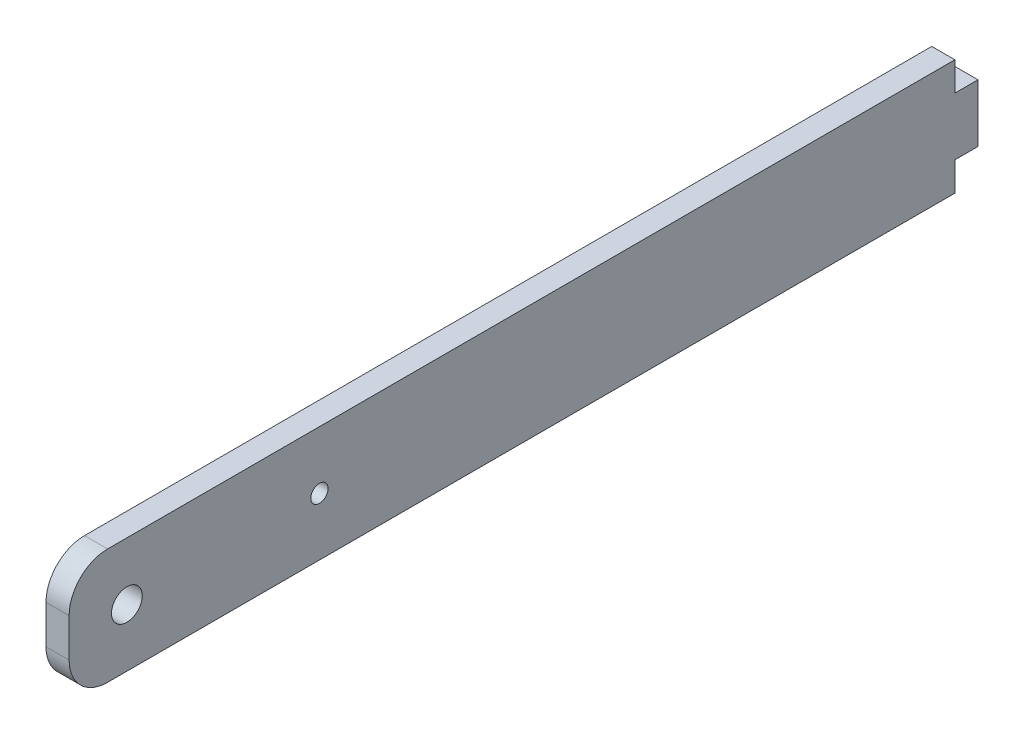
ISO-10303-21;
HEADER;
FILE_DESCRIPTION(('STEP AP214'),'2;1');
FILE_NAME('part.step','',(''),(''),'','','');
FILE_SCHEMA(('AUTOMOTIVE_DESIGN { 1 0 10303 214 1 1 1 1 }'));
ENDSEC;
DATA;
#1=APPLICATION_CONTEXT('core data for automotive mechanical design processes');
#2=APPLICATION_PROTOCOL_DEFINITION('international standard','automotive_design',2000,#1);
#3=PRODUCT_CONTEXT('',#1,'mechanical');
#4=PRODUCT('Part','Part','',(#3));
#5=PRODUCT_RELATED_PRODUCT_CATEGORY('part','',(#4));
#6=PRODUCT_DEFINITION_FORMATION('','',#4);
#7=PRODUCT_DEFINITION_CONTEXT('part definition',#1,'design');
#8=PRODUCT_DEFINITION('design','',#6,#7);
#9=PRODUCT_DEFINITION_SHAPE('','',#8);
#10=(LENGTH_UNIT() NAMED_UNIT(*) SI_UNIT(.MILLI.,.METRE.));
#11=(NAMED_UNIT(*) PLANE_ANGLE_UNIT() SI_UNIT($,.RADIAN.));
#12=(NAMED_UNIT(*) SI_UNIT($,.STERADIAN.) SOLID_ANGLE_UNIT());
#13=UNCERTAINTY_MEASURE_WITH_UNIT(LENGTH_MEASURE(1.E-05),#10,'distance_accuracy_value','');
#14=(GEOMETRIC_REPRESENTATION_CONTEXT(3) GLOBAL_UNCERTAINTY_ASSIGNED_CONTEXT((#13)) GLOBAL_UNIT_ASSIGNED_CONTEXT((#10,
#11,#12)) REPRESENTATION_CONTEXT('',''));
#15=CARTESIAN_POINT('',(0.,0.,0.));
#16=DIRECTION('',(0.,0.,1.));
#17=DIRECTION('',(1.,0.,0.));
#18=AXIS2_PLACEMENT_3D('',#15,#16,#17);
#19=CARTESIAN_POINT('',(3.,15.,-115.));
#20=DIRECTION('',(0.,0.,1.));
#21=DIRECTION('',(1.,0.,0.));
#22=AXIS2_PLACEMENT_3D('',#19,#20,#21);
#23=PLANE('',#22);
#24=DIRECTION('',(1.,0.,0.));
#25=VECTOR('',#24,1.);
#26=CARTESIAN_POINT('',(-3.,7.5,-115.));
#27=LINE('',#26,#25);
#28=CARTESIAN_POINT('',(-3.,7.5,-115.));
#29=VERTEX_POINT('',#28);
#30=CARTESIAN_POINT('',(3.,7.5,-115.));
#31=VERTEX_POINT('',#30);
#32=EDGE_CURVE('E212',#29,#31,#27,.T.);
#33=ORIENTED_EDGE('',*,*,#32,.F.);
#34=DIRECTION('',(0.,1.,0.));
#35=VECTOR('',#34,1.);
#36=CARTESIAN_POINT('',(-3.,15.,-115.));
#37=LINE('',#36,#35);
#38=CARTESIAN_POINT('',(-3.,15.,-115.));
#39=VERTEX_POINT('',#38);
#40=EDGE_CURVE('E148',#29,#39,#37,.T.);
#41=ORIENTED_EDGE('',*,*,#40,.T.);
#42=DIRECTION('',(-1.,0.,0.));
#43=VECTOR('',#42,1.);
#44=CARTESIAN_POINT('',(3.,15.,-115.));
#45=LINE('',#44,#43);
#46=CARTESIAN_POINT('',(3.,15.,-115.));
#47=VERTEX_POINT('',#46);
#48=EDGE_CURVE('E156',#47,#39,#45,.T.);
#49=ORIENTED_EDGE('',*,*,#48,.F.);
#50=DIRECTION('',(0.,1.,0.));
#51=VECTOR('',#50,1.);
#52=CARTESIAN_POINT('',(3.,15.,-115.));
#53=LINE('',#52,#51);
#54=EDGE_CURVE('E187',#31,#47,#53,.T.);
#55=ORIENTED_EDGE('',*,*,#54,.F.);
#56=EDGE_LOOP('',(#33,#41,#49,#55));
#57=FACE_BOUND('',#56,.T.);
#58=ADVANCED_FACE('F45',(#57),#23,.F.);
#59=CARTESIAN_POINT('',(3.,0.,0.));
#60=DIRECTION('',(-1.,0.,0.));
#61=DIRECTION('',(0.,0.,1.));
#62=AXIS2_PLACEMENT_3D('',#59,#60,#61);
#63=PLANE('',#62);
#64=DIRECTION('',(0.,-1.,0.));
#65=VECTOR('',#64,1.);
#66=CARTESIAN_POINT('',(3.,15.,115.));
#67=LINE('',#66,#65);
#68=CARTESIAN_POINT('',(3.,5.,115.));
#69=VERTEX_POINT('',#68);
#70=CARTESIAN_POINT('',(3.,-5.,115.));
#71=VERTEX_POINT('',#70);
#72=EDGE_CURVE('E150',#69,#71,#67,.T.);
#73=ORIENTED_EDGE('',*,*,#72,.T.);
#74=CARTESIAN_POINT('',(3.,-5.,105.));
#75=DIRECTION('',(-1.,0.,0.));
#76=DIRECTION('',(0.,0.,1.));
#77=AXIS2_PLACEMENT_3D('',#74,#75,#76);
#78=CIRCLE('',#77,10.);
#79=CARTESIAN_POINT('',(3.,-15.,105.));
#80=VERTEX_POINT('',#79);
#81=EDGE_CURVE('E53',#71,#80,#78,.F.);
#82=ORIENTED_EDGE('',*,*,#81,.T.);
#83=DIRECTION('',(0.,0.,-1.));
#84=VECTOR('',#83,1.);
#85=CARTESIAN_POINT('',(3.,-15.,-115.));
#86=LINE('',#85,#84);
#87=CARTESIAN_POINT('',(3.,-15.,-115.));
#88=VERTEX_POINT('',#87);
#89=EDGE_CURVE('E180',#80,#88,#86,.T.);
#90=ORIENTED_EDGE('',*,*,#89,.T.);
#91=CARTESIAN_POINT('',(3.,-7.5,-115.));
#92=VERTEX_POINT('',#91);
#93=EDGE_CURVE('E202',#88,#92,#53,.T.);
#94=ORIENTED_EDGE('',*,*,#93,.T.);
#95=DIRECTION('',(0.,0.,-1.));
#96=VECTOR('',#95,1.);
#97=CARTESIAN_POINT('',(3.,-7.5,-115.));
#98=LINE('',#97,#96);
#99=CARTESIAN_POINT('',(3.,-7.5,-121.));
#100=VERTEX_POINT('',#99);
#101=EDGE_CURVE('E60',#92,#100,#98,.T.);
#102=ORIENTED_EDGE('',*,*,#101,.T.);
#103=DIRECTION('',(0.,1.,0.));
#104=VECTOR('',#103,1.);
#105=CARTESIAN_POINT('',(3.,7.5,-121.));
#106=LINE('',#105,#104);
#107=CARTESIAN_POINT('',(3.,7.5,-121.));
#108=VERTEX_POINT('',#107);
#109=EDGE_CURVE('E220',#100,#108,#106,.T.);
#110=ORIENTED_EDGE('',*,*,#109,.T.);
#111=DIRECTION('',(0.,0.,1.));
#112=VECTOR('',#111,1.);
#113=CARTESIAN_POINT('',(3.,7.5,-115.));
#114=LINE('',#113,#112);
#115=EDGE_CURVE('E141',#108,#31,#114,.T.);
#116=ORIENTED_EDGE('',*,*,#115,.T.);
#117=ORIENTED_EDGE('',*,*,#54,.T.);
#118=DIRECTION('',(0.,0.,1.));
#119=VECTOR('',#118,1.);
#120=CARTESIAN_POINT('',(3.,15.,115.));
#121=LINE('',#120,#119);
#122=CARTESIAN_POINT('',(3.,15.,105.));
#123=VERTEX_POINT('',#122);
#124=EDGE_CURVE('E159',#47,#123,#121,.T.);
#125=ORIENTED_EDGE('',*,*,#124,.T.);
#126=CARTESIAN_POINT('',(3.,5.,105.));
#127=DIRECTION('',(-1.,0.,0.));
#128=DIRECTION('',(0.,0.,1.));
#129=AXIS2_PLACEMENT_3D('',#126,#127,#128);
#130=CIRCLE('',#129,10.);
#131=EDGE_CURVE('E173',#123,#69,#130,.F.);
#132=ORIENTED_EDGE('',*,*,#131,.T.);
#133=EDGE_LOOP('',(#73,#82,#90,#94,#102,#110,#116,#117,#125,#132));
#134=FACE_BOUND('',#133,.T.);
#135=CARTESIAN_POINT('',(3.,0.,100.));
#136=DIRECTION('',(1.,0.,0.));
#137=DIRECTION('',(0.,0.,-1.));
#138=AXIS2_PLACEMENT_3D('',#135,#136,#137);
#139=CIRCLE('',#138,3.99999999999999);
#140=CARTESIAN_POINT('',(3.,0.,96.));
#141=VERTEX_POINT('',#140);
#142=EDGE_CURVE('E196',#141,#141,#139,.T.);
#143=ORIENTED_EDGE('',*,*,#142,.F.);
#144=EDGE_LOOP('',(#143));
#145=FACE_BOUND('',#144,.T.);
#146=CARTESIAN_POINT('',(3.,0.,50.));
#147=DIRECTION('',(1.,0.,0.));
#148=DIRECTION('',(0.,0.,-1.));
#149=AXIS2_PLACEMENT_3D('',#146,#147,#148);
#150=CIRCLE('',#149,2.24999999999999);
#151=CARTESIAN_POINT('',(3.,0.,47.75));
#152=VERTEX_POINT('',#151);
#153=EDGE_CURVE('E210',#152,#152,#150,.T.);
#154=ORIENTED_EDGE('',*,*,#153,.F.);
#155=EDGE_LOOP('',(#154));
#156=FACE_BOUND('',#155,.T.);
#157=ADVANCED_FACE('F178',(#134,#145,#156),#63,.F.);
#158=CARTESIAN_POINT('',(-3.,0.,0.));
#159=DIRECTION('',(-1.,0.,0.));
#160=DIRECTION('',(0.,0.,1.));
#161=AXIS2_PLACEMENT_3D('',#158,#159,#160);
#162=PLANE('',#161);
#163=CARTESIAN_POINT('',(-3.,0.,50.));
#164=DIRECTION('',(-1.,0.,0.));
#165=DIRECTION('',(0.,0.,1.));
#166=AXIS2_PLACEMENT_3D('',#163,#164,#165);
#167=CIRCLE('',#166,2.24999999999999);
#168=CARTESIAN_POINT('',(-3.,0.,52.25));
#169=VERTEX_POINT('',#168);
#170=EDGE_CURVE('E206',#169,#169,#167,.T.);
#171=ORIENTED_EDGE('',*,*,#170,.F.);
#172=EDGE_LOOP('',(#171));
#173=FACE_BOUND('',#172,.T.);
#174=DIRECTION('',(0.,0.,-1.));
#175=VECTOR('',#174,1.);
#176=CARTESIAN_POINT('',(-3.,-15.,-115.));
#177=LINE('',#176,#175);
#178=CARTESIAN_POINT('',(-3.,-15.,105.));
#179=VERTEX_POINT('',#178);
#180=CARTESIAN_POINT('',(-3.,-15.,-115.));
#181=VERTEX_POINT('',#180);
#182=EDGE_CURVE('E152',#179,#181,#177,.T.);
#183=ORIENTED_EDGE('',*,*,#182,.F.);
#184=CARTESIAN_POINT('',(-3.,-5.,105.));
#185=DIRECTION('',(-1.,0.,0.));
#186=DIRECTION('',(0.,0.,1.));
#187=AXIS2_PLACEMENT_3D('',#184,#185,#186);
#188=CIRCLE('',#187,10.);
#189=CARTESIAN_POINT('',(-3.,-5.,115.));
#190=VERTEX_POINT('',#189);
#191=EDGE_CURVE('E166',#179,#190,#188,.T.);
#192=ORIENTED_EDGE('',*,*,#191,.T.);
#193=DIRECTION('',(0.,-1.,0.));
#194=VECTOR('',#193,1.);
#195=CARTESIAN_POINT('',(-3.,15.,115.));
#196=LINE('',#195,#194);
#197=CARTESIAN_POINT('',(-3.,5.,115.));
#198=VERTEX_POINT('',#197);
#199=EDGE_CURVE('E192',#198,#190,#196,.T.);
#200=ORIENTED_EDGE('',*,*,#199,.F.);
#201=CARTESIAN_POINT('',(-3.,5.,105.));
#202=DIRECTION('',(-1.,0.,0.));
#203=DIRECTION('',(0.,0.,1.));
#204=AXIS2_PLACEMENT_3D('',#201,#202,#203);
#205=CIRCLE('',#204,10.);
#206=CARTESIAN_POINT('',(-3.,15.,105.));
#207=VERTEX_POINT('',#206);
#208=EDGE_CURVE('E164',#198,#207,#205,.T.);
#209=ORIENTED_EDGE('',*,*,#208,.T.);
#210=DIRECTION('',(0.,0.,1.));
#211=VECTOR('',#210,1.);
#212=CARTESIAN_POINT('',(-3.,15.,115.));
#213=LINE('',#212,#211);
#214=EDGE_CURVE('E147',#39,#207,#213,.T.);
#215=ORIENTED_EDGE('',*,*,#214,.F.);
#216=ORIENTED_EDGE('',*,*,#40,.F.);
#217=DIRECTION('',(0.,0.,1.));
#218=VECTOR('',#217,1.);
#219=CARTESIAN_POINT('',(-3.,7.5,-115.));
#220=LINE('',#219,#218);
#221=CARTESIAN_POINT('',(-3.,7.5,-121.));
#222=VERTEX_POINT('',#221);
#223=EDGE_CURVE('E129',#222,#29,#220,.T.);
#224=ORIENTED_EDGE('',*,*,#223,.F.);
#225=DIRECTION('',(0.,1.,0.));
#226=VECTOR('',#225,1.);
#227=CARTESIAN_POINT('',(-3.,7.5,-121.));
#228=LINE('',#227,#226);
#229=CARTESIAN_POINT('',(-3.,-7.5,-121.));
#230=VERTEX_POINT('',#229);
#231=EDGE_CURVE('E140',#230,#222,#228,.T.);
#232=ORIENTED_EDGE('',*,*,#231,.F.);
#233=DIRECTION('',(0.,0.,-1.));
#234=VECTOR('',#233,1.);
#235=CARTESIAN_POINT('',(-3.,-7.5,-115.));
#236=LINE('',#235,#234);
#237=CARTESIAN_POINT('',(-3.,-7.5,-115.));
#238=VERTEX_POINT('',#237);
#239=EDGE_CURVE('E123',#238,#230,#236,.T.);
#240=ORIENTED_EDGE('',*,*,#239,.F.);
#241=EDGE_CURVE('E137',#181,#238,#37,.T.);
#242=ORIENTED_EDGE('',*,*,#241,.F.);
#243=EDGE_LOOP('',(#183,#192,#200,#209,#215,#216,#224,#232,#240,#242));
#244=FACE_BOUND('',#243,.T.);
#245=CARTESIAN_POINT('',(-3.,0.,100.));
#246=DIRECTION('',(1.,0.,0.));
#247=DIRECTION('',(0.,0.,-1.));
#248=AXIS2_PLACEMENT_3D('',#245,#246,#247);
#249=CIRCLE('',#248,3.99999999999999);
#250=CARTESIAN_POINT('',(-3.,0.,96.));
#251=VERTEX_POINT('',#250);
#252=EDGE_CURVE('E198',#251,#251,#249,.T.);
#253=ORIENTED_EDGE('',*,*,#252,.T.);
#254=EDGE_LOOP('',(#253));
#255=FACE_BOUND('',#254,.T.);
#256=ADVANCED_FACE('F135',(#173,#244,#255),#162,.T.);
#257=CARTESIAN_POINT('',(3.,15.,115.));
#258=DIRECTION('',(0.,0.,-1.));
#259=DIRECTION('',(-1.,0.,0.));
#260=AXIS2_PLACEMENT_3D('',#257,#258,#259);
#261=PLANE('',#260);
#262=ORIENTED_EDGE('',*,*,#199,.T.);
#263=DIRECTION('',(-1.,0.,0.));
#264=VECTOR('',#263,1.);
#265=CARTESIAN_POINT('',(3.,-5.,115.));
#266=LINE('',#265,#264);
#267=EDGE_CURVE('E171',#190,#71,#266,.F.);
#268=ORIENTED_EDGE('',*,*,#267,.T.);
#269=ORIENTED_EDGE('',*,*,#72,.F.);
#270=DIRECTION('',(-1.,0.,0.));
#271=VECTOR('',#270,1.);
#272=CARTESIAN_POINT('',(3.,5.,115.));
#273=LINE('',#272,#271);
#274=EDGE_CURVE('E168',#69,#198,#273,.T.);
#275=ORIENTED_EDGE('',*,*,#274,.T.);
#276=EDGE_LOOP('',(#262,#268,#269,#275));
#277=FACE_BOUND('',#276,.T.);
#278=ADVANCED_FACE('F194',(#277),#261,.F.);
#279=CARTESIAN_POINT('',(3.,-15.,-115.));
#280=DIRECTION('',(0.,1.,0.));
#281=DIRECTION('',(0.,0.,1.));
#282=AXIS2_PLACEMENT_3D('',#279,#280,#281);
#283=PLANE('',#282);
#284=ORIENTED_EDGE('',*,*,#89,.F.);
#285=DIRECTION('',(-1.,0.,0.));
#286=VECTOR('',#285,1.);
#287=CARTESIAN_POINT('',(3.,-15.,105.));
#288=LINE('',#287,#286);
#289=EDGE_CURVE('E161',#80,#179,#288,.T.);
#290=ORIENTED_EDGE('',*,*,#289,.T.);
#291=ORIENTED_EDGE('',*,*,#182,.T.);
#292=DIRECTION('',(-1.,0.,0.));
#293=VECTOR('',#292,1.);
#294=CARTESIAN_POINT('',(3.,-15.,-115.));
#295=LINE('',#294,#293);
#296=EDGE_CURVE('E146',#88,#181,#295,.T.);
#297=ORIENTED_EDGE('',*,*,#296,.F.);
#298=EDGE_LOOP('',(#284,#290,#291,#297));
#299=FACE_BOUND('',#298,.T.);
#300=ADVANCED_FACE('F186',(#299),#283,.F.);
#301=ORIENTED_EDGE('',*,*,#241,.T.);
#302=DIRECTION('',(1.,0.,0.));
#303=VECTOR('',#302,1.);
#304=CARTESIAN_POINT('',(-3.,-7.5,-115.));
#305=LINE('',#304,#303);
#306=EDGE_CURVE('E120',#238,#92,#305,.T.);
#307=ORIENTED_EDGE('',*,*,#306,.T.);
#308=ORIENTED_EDGE('',*,*,#93,.F.);
#309=ORIENTED_EDGE('',*,*,#296,.T.);
#310=EDGE_LOOP('',(#301,#307,#308,#309));
#311=FACE_BOUND('',#310,.T.);
#312=ADVANCED_FACE('F144',(#311),#23,.F.);
#313=CARTESIAN_POINT('',(3.,15.,115.));
#314=DIRECTION('',(0.,-1.,0.));
#315=DIRECTION('',(0.,0.,-1.));
#316=AXIS2_PLACEMENT_3D('',#313,#314,#315);
#317=PLANE('',#316);
#318=ORIENTED_EDGE('',*,*,#214,.T.);
#319=DIRECTION('',(-1.,0.,0.));
#320=VECTOR('',#319,1.);
#321=CARTESIAN_POINT('',(3.,15.,105.));
#322=LINE('',#321,#320);
#323=EDGE_CURVE('E13',#207,#123,#322,.F.);
#324=ORIENTED_EDGE('',*,*,#323,.T.);
#325=ORIENTED_EDGE('',*,*,#124,.F.);
#326=ORIENTED_EDGE('',*,*,#48,.T.);
#327=EDGE_LOOP('',(#318,#324,#325,#326));
#328=FACE_BOUND('',#327,.T.);
#329=ADVANCED_FACE('F239',(#328),#317,.F.);
#330=CARTESIAN_POINT('',(3.,0.,100.));
#331=DIRECTION('',(-1.,0.,0.));
#332=DIRECTION('',(0.,0.,1.));
#333=AXIS2_PLACEMENT_3D('',#330,#331,#332);
#334=CYLINDRICAL_SURFACE('',#333,3.99999999999999);
#335=ORIENTED_EDGE('',*,*,#142,.T.);
#336=EDGE_LOOP('',(#335));
#337=FACE_BOUND('',#336,.T.);
#338=ORIENTED_EDGE('',*,*,#252,.F.);
#339=EDGE_LOOP('',(#338));
#340=FACE_BOUND('',#339,.T.);
#341=ADVANCED_FACE('F241',(#337,#340),#334,.F.);
#342=CARTESIAN_POINT('',(3.,0.,50.));
#343=DIRECTION('',(1.,0.,0.));
#344=DIRECTION('',(0.,0.,-1.));
#345=AXIS2_PLACEMENT_3D('',#342,#343,#344);
#346=CYLINDRICAL_SURFACE('',#345,2.24999999999999);
#347=ORIENTED_EDGE('',*,*,#153,.T.);
#348=EDGE_LOOP('',(#347));
#349=FACE_BOUND('',#348,.T.);
#350=ORIENTED_EDGE('',*,*,#170,.T.);
#351=EDGE_LOOP('',(#350));
#352=FACE_BOUND('',#351,.T.);
#353=ADVANCED_FACE('F247',(#349,#352),#346,.F.);
#354=CARTESIAN_POINT('',(3.,-5.,105.));
#355=DIRECTION('',(-1.,0.,0.));
#356=DIRECTION('',(0.,0.,1.));
#357=AXIS2_PLACEMENT_3D('',#354,#355,#356);
#358=CYLINDRICAL_SURFACE('',#357,10.);
#359=ORIENTED_EDGE('',*,*,#81,.F.);
#360=ORIENTED_EDGE('',*,*,#267,.F.);
#361=ORIENTED_EDGE('',*,*,#191,.F.);
#362=ORIENTED_EDGE('',*,*,#289,.F.);
#363=EDGE_LOOP('',(#359,#360,#361,#362));
#364=FACE_BOUND('',#363,.T.);
#365=ADVANCED_FACE('F189',(#364),#358,.T.);
#366=CARTESIAN_POINT('',(3.,5.,105.));
#367=DIRECTION('',(-1.,0.,0.));
#368=DIRECTION('',(0.,0.,1.));
#369=AXIS2_PLACEMENT_3D('',#366,#367,#368);
#370=CYLINDRICAL_SURFACE('',#369,10.);
#371=ORIENTED_EDGE('',*,*,#131,.F.);
#372=ORIENTED_EDGE('',*,*,#323,.F.);
#373=ORIENTED_EDGE('',*,*,#208,.F.);
#374=ORIENTED_EDGE('',*,*,#274,.F.);
#375=EDGE_LOOP('',(#371,#372,#373,#374));
#376=FACE_BOUND('',#375,.T.);
#377=ADVANCED_FACE('F47',(#376),#370,.T.);
#378=CARTESIAN_POINT('',(-3.,7.5,-115.));
#379=DIRECTION('',(0.,1.,0.));
#380=DIRECTION('',(0.,0.,1.));
#381=AXIS2_PLACEMENT_3D('',#378,#379,#380);
#382=PLANE('',#381);
#383=ORIENTED_EDGE('',*,*,#115,.F.);
#384=DIRECTION('',(1.,0.,0.));
#385=VECTOR('',#384,1.);
#386=CARTESIAN_POINT('',(-3.,7.5,-121.));
#387=LINE('',#386,#385);
#388=EDGE_CURVE('E215',#222,#108,#387,.T.);
#389=ORIENTED_EDGE('',*,*,#388,.F.);
#390=ORIENTED_EDGE('',*,*,#223,.T.);
#391=ORIENTED_EDGE('',*,*,#32,.T.);
#392=EDGE_LOOP('',(#383,#389,#390,#391));
#393=FACE_BOUND('',#392,.T.);
#394=ADVANCED_FACE('F233',(#393),#382,.T.);
#395=CARTESIAN_POINT('',(-3.,7.5,-121.));
#396=DIRECTION('',(0.,0.,-1.));
#397=DIRECTION('',(-1.,0.,0.));
#398=AXIS2_PLACEMENT_3D('',#395,#396,#397);
#399=PLANE('',#398);
#400=ORIENTED_EDGE('',*,*,#109,.F.);
#401=DIRECTION('',(1.,0.,0.));
#402=VECTOR('',#401,1.);
#403=CARTESIAN_POINT('',(-3.,-7.5,-121.));
#404=LINE('',#403,#402);
#405=EDGE_CURVE('E128',#230,#100,#404,.T.);
#406=ORIENTED_EDGE('',*,*,#405,.F.);
#407=ORIENTED_EDGE('',*,*,#231,.T.);
#408=ORIENTED_EDGE('',*,*,#388,.T.);
#409=EDGE_LOOP('',(#400,#406,#407,#408));
#410=FACE_BOUND('',#409,.T.);
#411=ADVANCED_FACE('F227',(#410),#399,.T.);
#412=CARTESIAN_POINT('',(-3.,-7.5,-115.));
#413=DIRECTION('',(0.,-1.,0.));
#414=DIRECTION('',(0.,0.,-1.));
#415=AXIS2_PLACEMENT_3D('',#412,#413,#414);
#416=PLANE('',#415);
#417=ORIENTED_EDGE('',*,*,#101,.F.);
#418=ORIENTED_EDGE('',*,*,#306,.F.);
#419=ORIENTED_EDGE('',*,*,#239,.T.);
#420=ORIENTED_EDGE('',*,*,#405,.T.);
#421=EDGE_LOOP('',(#417,#418,#419,#420));
#422=FACE_BOUND('',#421,.T.);
#423=ADVANCED_FACE('F122',(#422),#416,.T.);
#424=CLOSED_SHELL('',(#58,#157,#256,#278,#300,#312,#329,#341,#353,#365,#377,#394,#411,#423));
#425=MANIFOLD_SOLID_BREP('B2',#424);
#426=ADVANCED_BREP_SHAPE_REPRESENTATION('',(#18,#425),#14);
#427=SHAPE_DEFINITION_REPRESENTATION(#9,#426);
ENDSEC;
END-ISO-10303-21;
